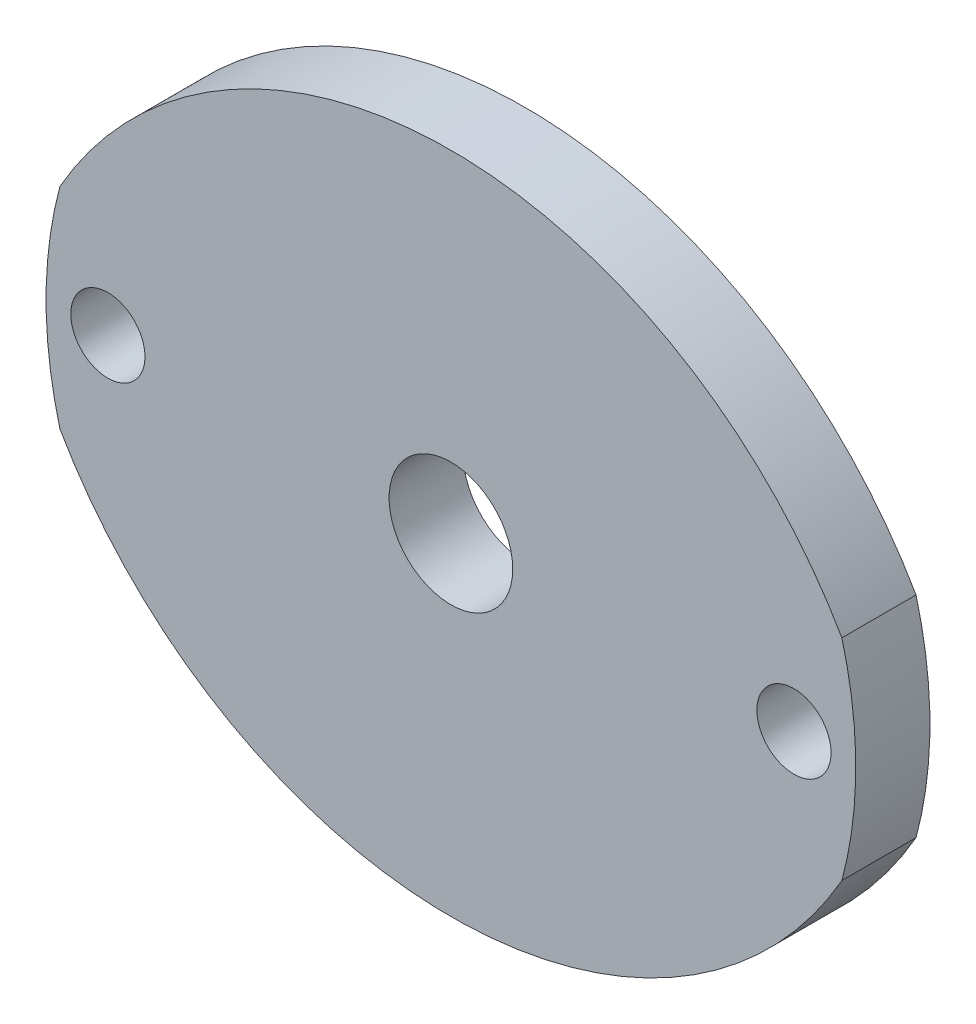
ISO-10303-21;
HEADER;
FILE_DESCRIPTION(('STEP AP214'),'2;1');
FILE_NAME('part.step','',(''),(''),'','','');
FILE_SCHEMA(('AUTOMOTIVE_DESIGN { 1 0 10303 214 1 1 1 1 }'));
ENDSEC;
DATA;
#1=APPLICATION_CONTEXT('core data for automotive mechanical design processes');
#2=APPLICATION_PROTOCOL_DEFINITION('international standard','automotive_design',2000,#1);
#3=PRODUCT_CONTEXT('',#1,'mechanical');
#4=PRODUCT('Part','Part','',(#3));
#5=PRODUCT_RELATED_PRODUCT_CATEGORY('part','',(#4));
#6=PRODUCT_DEFINITION_FORMATION('','',#4);
#7=PRODUCT_DEFINITION_CONTEXT('part definition',#1,'design');
#8=PRODUCT_DEFINITION('design','',#6,#7);
#9=PRODUCT_DEFINITION_SHAPE('','',#8);
#10=(LENGTH_UNIT() NAMED_UNIT(*) SI_UNIT(.MILLI.,.METRE.));
#11=(NAMED_UNIT(*) PLANE_ANGLE_UNIT() SI_UNIT($,.RADIAN.));
#12=(NAMED_UNIT(*) SI_UNIT($,.STERADIAN.) SOLID_ANGLE_UNIT());
#13=UNCERTAINTY_MEASURE_WITH_UNIT(LENGTH_MEASURE(1.E-05),#10,'distance_accuracy_value','');
#14=(GEOMETRIC_REPRESENTATION_CONTEXT(3) GLOBAL_UNCERTAINTY_ASSIGNED_CONTEXT((#13)) GLOBAL_UNIT_ASSIGNED_CONTEXT((#10,
#11,#12)) REPRESENTATION_CONTEXT('',''));
#15=CARTESIAN_POINT('',(0.,0.,0.));
#16=DIRECTION('',(0.,0.,1.));
#17=DIRECTION('',(1.,0.,0.));
#18=AXIS2_PLACEMENT_3D('',#15,#16,#17);
#19=CARTESIAN_POINT('',(18.2001874985084,-2.62133091602151,3.));
#20=DIRECTION('',(0.,0.,1.));
#21=DIRECTION('',(1.,0.,0.));
#22=AXIS2_PLACEMENT_3D('',#19,#20,#21);
#23=PLANE('',#22);
#24=CARTESIAN_POINT('',(32.0751874985084,-0.225930840215161,3.));
#25=DIRECTION('',(0.,0.,1.));
#26=DIRECTION('',(1.,0.,0.));
#27=AXIS2_PLACEMENT_3D('',#24,#25,#26);
#28=CIRCLE('',#27,1.5);
#29=CARTESIAN_POINT('',(33.5751874985084,-0.225930840215161,3.));
#30=VERTEX_POINT('',#29);
#31=EDGE_CURVE('E116',#30,#30,#28,.T.);
#32=ORIENTED_EDGE('',*,*,#31,.F.);
#33=EDGE_LOOP('',(#32));
#34=FACE_BOUND('',#33,.T.);
#35=CARTESIAN_POINT('',(18.2001874985084,-5.01673099182787,3.));
#36=DIRECTION('',(0.,0.,1.));
#37=DIRECTION('',(1.,0.,0.));
#38=AXIS2_PLACEMENT_3D('',#35,#36,#37);
#39=CIRCLE('',#38,18.2158001516126);
#40=CARTESIAN_POINT('',(34.0140129597534,4.02419260284823,3.));
#41=VERTEX_POINT('',#40);
#42=CARTESIAN_POINT('',(2.38636203726337,4.02419260284834,3.));
#43=VERTEX_POINT('',#42);
#44=EDGE_CURVE('E86',#41,#43,#39,.T.);
#45=ORIENTED_EDGE('',*,*,#44,.T.);
#46=CARTESIAN_POINT('',(18.2001874985084,-0.225930840215161,3.));
#47=DIRECTION('',(0.,0.,1.));
#48=DIRECTION('',(1.,0.,0.));
#49=AXIS2_PLACEMENT_3D('',#46,#47,#48);
#50=CIRCLE('',#49,16.375);
#51=CARTESIAN_POINT('',(2.38636203726322,-4.47605428327809,3.));
#52=VERTEX_POINT('',#51);
#53=EDGE_CURVE('E81',#43,#52,#50,.T.);
#54=ORIENTED_EDGE('',*,*,#53,.T.);
#55=CARTESIAN_POINT('',(18.2001874985084,4.56486931139732,3.));
#56=DIRECTION('',(0.,0.,1.));
#57=DIRECTION('',(1.,0.,0.));
#58=AXIS2_PLACEMENT_3D('',#55,#56,#57);
#59=CIRCLE('',#58,18.2158001516126);
#60=CARTESIAN_POINT('',(34.0140129597537,-4.47605428327812,3.));
#61=VERTEX_POINT('',#60);
#62=EDGE_CURVE('E84',#52,#61,#59,.T.);
#63=ORIENTED_EDGE('',*,*,#62,.T.);
#64=CARTESIAN_POINT('',(18.2001874985084,-0.225930840215161,3.));
#65=DIRECTION('',(0.,0.,1.));
#66=DIRECTION('',(1.,0.,0.));
#67=AXIS2_PLACEMENT_3D('',#64,#65,#66);
#68=CIRCLE('',#67,16.375);
#69=EDGE_CURVE('E51',#61,#41,#68,.T.);
#70=ORIENTED_EDGE('',*,*,#69,.T.);
#71=EDGE_LOOP('',(#45,#54,#63,#70));
#72=FACE_BOUND('',#71,.T.);
#73=CARTESIAN_POINT('',(18.2001874985084,-0.225930840215161,3.));
#74=DIRECTION('',(0.,0.,1.));
#75=DIRECTION('',(1.,0.,0.));
#76=AXIS2_PLACEMENT_3D('',#73,#74,#75);
#77=CIRCLE('',#76,2.5);
#78=CARTESIAN_POINT('',(20.7001874985084,-0.225930840215161,3.));
#79=VERTEX_POINT('',#78);
#80=EDGE_CURVE('E101',#79,#79,#77,.T.);
#81=ORIENTED_EDGE('',*,*,#80,.F.);
#82=EDGE_LOOP('',(#81));
#83=FACE_BOUND('',#82,.T.);
#84=CARTESIAN_POINT('',(4.32518749850838,-0.225930840215161,3.));
#85=DIRECTION('',(0.,0.,1.));
#86=DIRECTION('',(1.,0.,0.));
#87=AXIS2_PLACEMENT_3D('',#84,#85,#86);
#88=CIRCLE('',#87,1.5);
#89=CARTESIAN_POINT('',(5.82518749850838,-0.225930840215161,3.));
#90=VERTEX_POINT('',#89);
#91=EDGE_CURVE('E122',#90,#90,#88,.T.);
#92=ORIENTED_EDGE('',*,*,#91,.F.);
#93=EDGE_LOOP('',(#92));
#94=FACE_BOUND('',#93,.T.);
#95=ADVANCED_FACE('F34',(#34,#72,#83,#94),#23,.T.);
#96=CARTESIAN_POINT('',(18.2001874985084,-2.62133091602151,0.));
#97=DIRECTION('',(0.,0.,1.));
#98=DIRECTION('',(1.,0.,0.));
#99=AXIS2_PLACEMENT_3D('',#96,#97,#98);
#100=PLANE('',#99);
#101=CARTESIAN_POINT('',(18.2001874985084,-5.01673099182787,0.));
#102=DIRECTION('',(0.,0.,1.));
#103=DIRECTION('',(1.,0.,0.));
#104=AXIS2_PLACEMENT_3D('',#101,#102,#103);
#105=CIRCLE('',#104,18.2158001516126);
#106=CARTESIAN_POINT('',(34.0140129597534,4.02419260284823,0.));
#107=VERTEX_POINT('',#106);
#108=CARTESIAN_POINT('',(2.38636203726337,4.02419260284834,0.));
#109=VERTEX_POINT('',#108);
#110=EDGE_CURVE('E98',#107,#109,#105,.T.);
#111=ORIENTED_EDGE('',*,*,#110,.F.);
#112=CARTESIAN_POINT('',(18.2001874985084,-0.225930840215161,0.));
#113=DIRECTION('',(0.,0.,1.));
#114=DIRECTION('',(1.,0.,0.));
#115=AXIS2_PLACEMENT_3D('',#112,#113,#114);
#116=CIRCLE('',#115,16.375);
#117=CARTESIAN_POINT('',(34.0140129597537,-4.47605428327812,0.));
#118=VERTEX_POINT('',#117);
#119=EDGE_CURVE('E74',#118,#107,#116,.T.);
#120=ORIENTED_EDGE('',*,*,#119,.F.);
#121=CARTESIAN_POINT('',(18.2001874985084,4.56486931139732,0.));
#122=DIRECTION('',(0.,0.,1.));
#123=DIRECTION('',(1.,0.,0.));
#124=AXIS2_PLACEMENT_3D('',#121,#122,#123);
#125=CIRCLE('',#124,18.2158001516126);
#126=CARTESIAN_POINT('',(2.38636203726322,-4.47605428327809,0.));
#127=VERTEX_POINT('',#126);
#128=EDGE_CURVE('E68',#127,#118,#125,.T.);
#129=ORIENTED_EDGE('',*,*,#128,.F.);
#130=CARTESIAN_POINT('',(18.2001874985084,-0.225930840215161,0.));
#131=DIRECTION('',(0.,0.,1.));
#132=DIRECTION('',(1.,0.,0.));
#133=AXIS2_PLACEMENT_3D('',#130,#131,#132);
#134=CIRCLE('',#133,16.375);
#135=EDGE_CURVE('E90',#109,#127,#134,.T.);
#136=ORIENTED_EDGE('',*,*,#135,.F.);
#137=EDGE_LOOP('',(#111,#120,#129,#136));
#138=FACE_BOUND('',#137,.T.);
#139=CARTESIAN_POINT('',(18.2001874985084,-0.225930840215161,0.));
#140=DIRECTION('',(0.,0.,1.));
#141=DIRECTION('',(1.,0.,0.));
#142=AXIS2_PLACEMENT_3D('',#139,#140,#141);
#143=CIRCLE('',#142,2.5);
#144=CARTESIAN_POINT('',(20.7001874985084,-0.225930840215161,0.));
#145=VERTEX_POINT('',#144);
#146=EDGE_CURVE('E113',#145,#145,#143,.T.);
#147=ORIENTED_EDGE('',*,*,#146,.T.);
#148=EDGE_LOOP('',(#147));
#149=FACE_BOUND('',#148,.T.);
#150=CARTESIAN_POINT('',(32.0751874985084,-0.225930840215161,0.));
#151=DIRECTION('',(0.,0.,1.));
#152=DIRECTION('',(1.,0.,0.));
#153=AXIS2_PLACEMENT_3D('',#150,#151,#152);
#154=CIRCLE('',#153,1.5);
#155=CARTESIAN_POINT('',(33.5751874985084,-0.225930840215161,0.));
#156=VERTEX_POINT('',#155);
#157=EDGE_CURVE('E119',#156,#156,#154,.T.);
#158=ORIENTED_EDGE('',*,*,#157,.T.);
#159=EDGE_LOOP('',(#158));
#160=FACE_BOUND('',#159,.T.);
#161=CARTESIAN_POINT('',(4.32518749850838,-0.225930840215161,0.));
#162=DIRECTION('',(0.,0.,1.));
#163=DIRECTION('',(1.,0.,0.));
#164=AXIS2_PLACEMENT_3D('',#161,#162,#163);
#165=CIRCLE('',#164,1.5);
#166=CARTESIAN_POINT('',(5.82518749850838,-0.225930840215161,0.));
#167=VERTEX_POINT('',#166);
#168=EDGE_CURVE('E125',#167,#167,#165,.T.);
#169=ORIENTED_EDGE('',*,*,#168,.T.);
#170=EDGE_LOOP('',(#169));
#171=FACE_BOUND('',#170,.T.);
#172=ADVANCED_FACE('F109',(#138,#149,#160,#171),#100,.F.);
#173=CARTESIAN_POINT('',(18.2001874985084,-5.01673099182787,3.));
#174=DIRECTION('',(0.,0.,-1.));
#175=DIRECTION('',(-1.,0.,0.));
#176=AXIS2_PLACEMENT_3D('',#173,#174,#175);
#177=CYLINDRICAL_SURFACE('',#176,18.2158001516126);
#178=ORIENTED_EDGE('',*,*,#110,.T.);
#179=DIRECTION('',(0.,0.,-1.));
#180=VECTOR('',#179,1.);
#181=CARTESIAN_POINT('',(2.38636203726337,4.02419260284834,3.));
#182=LINE('',#181,#180);
#183=EDGE_CURVE('E11',#43,#109,#182,.T.);
#184=ORIENTED_EDGE('',*,*,#183,.F.);
#185=ORIENTED_EDGE('',*,*,#44,.F.);
#186=DIRECTION('',(0.,0.,-1.));
#187=VECTOR('',#186,1.);
#188=CARTESIAN_POINT('',(34.0140129597534,4.02419260284823,3.));
#189=LINE('',#188,#187);
#190=EDGE_CURVE('E94',#41,#107,#189,.T.);
#191=ORIENTED_EDGE('',*,*,#190,.T.);
#192=EDGE_LOOP('',(#178,#184,#185,#191));
#193=FACE_BOUND('',#192,.T.);
#194=ADVANCED_FACE('F36',(#193),#177,.T.);
#195=CARTESIAN_POINT('',(18.2001874985084,-0.225930840215161,3.));
#196=DIRECTION('',(0.,0.,-1.));
#197=DIRECTION('',(-1.,0.,0.));
#198=AXIS2_PLACEMENT_3D('',#195,#196,#197);
#199=CYLINDRICAL_SURFACE('',#198,16.375);
#200=ORIENTED_EDGE('',*,*,#135,.T.);
#201=DIRECTION('',(0.,0.,-1.));
#202=VECTOR('',#201,1.);
#203=CARTESIAN_POINT('',(2.38636203726322,-4.47605428327809,3.));
#204=LINE('',#203,#202);
#205=EDGE_CURVE('E43',#52,#127,#204,.T.);
#206=ORIENTED_EDGE('',*,*,#205,.F.);
#207=ORIENTED_EDGE('',*,*,#53,.F.);
#208=ORIENTED_EDGE('',*,*,#183,.T.);
#209=EDGE_LOOP('',(#200,#206,#207,#208));
#210=FACE_BOUND('',#209,.T.);
#211=ADVANCED_FACE('F89',(#210),#199,.T.);
#212=CARTESIAN_POINT('',(18.2001874985084,4.56486931139732,3.));
#213=DIRECTION('',(0.,0.,-1.));
#214=DIRECTION('',(-1.,0.,0.));
#215=AXIS2_PLACEMENT_3D('',#212,#213,#214);
#216=CYLINDRICAL_SURFACE('',#215,18.2158001516126);
#217=ORIENTED_EDGE('',*,*,#128,.T.);
#218=DIRECTION('',(0.,0.,-1.));
#219=VECTOR('',#218,1.);
#220=CARTESIAN_POINT('',(34.0140129597537,-4.47605428327812,3.));
#221=LINE('',#220,#219);
#222=EDGE_CURVE('E91',#61,#118,#221,.T.);
#223=ORIENTED_EDGE('',*,*,#222,.F.);
#224=ORIENTED_EDGE('',*,*,#62,.F.);
#225=ORIENTED_EDGE('',*,*,#205,.T.);
#226=EDGE_LOOP('',(#217,#223,#224,#225));
#227=FACE_BOUND('',#226,.T.);
#228=ADVANCED_FACE('F92',(#227),#216,.T.);
#229=CARTESIAN_POINT('',(18.2001874985084,-0.225930840215161,3.));
#230=DIRECTION('',(0.,0.,-1.));
#231=DIRECTION('',(-1.,0.,0.));
#232=AXIS2_PLACEMENT_3D('',#229,#230,#231);
#233=CYLINDRICAL_SURFACE('',#232,16.375);
#234=ORIENTED_EDGE('',*,*,#119,.T.);
#235=ORIENTED_EDGE('',*,*,#190,.F.);
#236=ORIENTED_EDGE('',*,*,#69,.F.);
#237=ORIENTED_EDGE('',*,*,#222,.T.);
#238=EDGE_LOOP('',(#234,#235,#236,#237));
#239=FACE_BOUND('',#238,.T.);
#240=ADVANCED_FACE('F106',(#239),#233,.T.);
#241=CARTESIAN_POINT('',(18.2001874985084,-0.225930840215161,3.));
#242=DIRECTION('',(0.,0.,-1.));
#243=DIRECTION('',(-1.,0.,0.));
#244=AXIS2_PLACEMENT_3D('',#241,#242,#243);
#245=CYLINDRICAL_SURFACE('',#244,2.5);
#246=ORIENTED_EDGE('',*,*,#80,.T.);
#247=EDGE_LOOP('',(#246));
#248=FACE_BOUND('',#247,.T.);
#249=ORIENTED_EDGE('',*,*,#146,.F.);
#250=EDGE_LOOP('',(#249));
#251=FACE_BOUND('',#250,.T.);
#252=ADVANCED_FACE('F143',(#248,#251),#245,.F.);
#253=CARTESIAN_POINT('',(32.0751874985084,-0.225930840215161,3.));
#254=DIRECTION('',(0.,0.,-1.));
#255=DIRECTION('',(-1.,0.,0.));
#256=AXIS2_PLACEMENT_3D('',#253,#254,#255);
#257=CYLINDRICAL_SURFACE('',#256,1.5);
#258=ORIENTED_EDGE('',*,*,#31,.T.);
#259=EDGE_LOOP('',(#258));
#260=FACE_BOUND('',#259,.T.);
#261=ORIENTED_EDGE('',*,*,#157,.F.);
#262=EDGE_LOOP('',(#261));
#263=FACE_BOUND('',#262,.T.);
#264=ADVANCED_FACE('F189',(#260,#263),#257,.F.);
#265=CARTESIAN_POINT('',(4.32518749850838,-0.225930840215161,3.));
#266=DIRECTION('',(0.,0.,-1.));
#267=DIRECTION('',(-1.,0.,0.));
#268=AXIS2_PLACEMENT_3D('',#265,#266,#267);
#269=CYLINDRICAL_SURFACE('',#268,1.5);
#270=ORIENTED_EDGE('',*,*,#91,.T.);
#271=EDGE_LOOP('',(#270));
#272=FACE_BOUND('',#271,.T.);
#273=ORIENTED_EDGE('',*,*,#168,.F.);
#274=EDGE_LOOP('',(#273));
#275=FACE_BOUND('',#274,.T.);
#276=ADVANCED_FACE('F131',(#272,#275),#269,.F.);
#277=CLOSED_SHELL('',(#95,#172,#194,#211,#228,#240,#252,#264,#276));
#278=MANIFOLD_SOLID_BREP('B2',#277);
#279=ADVANCED_BREP_SHAPE_REPRESENTATION('',(#18,#278),#14);
#280=SHAPE_DEFINITION_REPRESENTATION(#9,#279);
ENDSEC;
END-ISO-10303-21;
